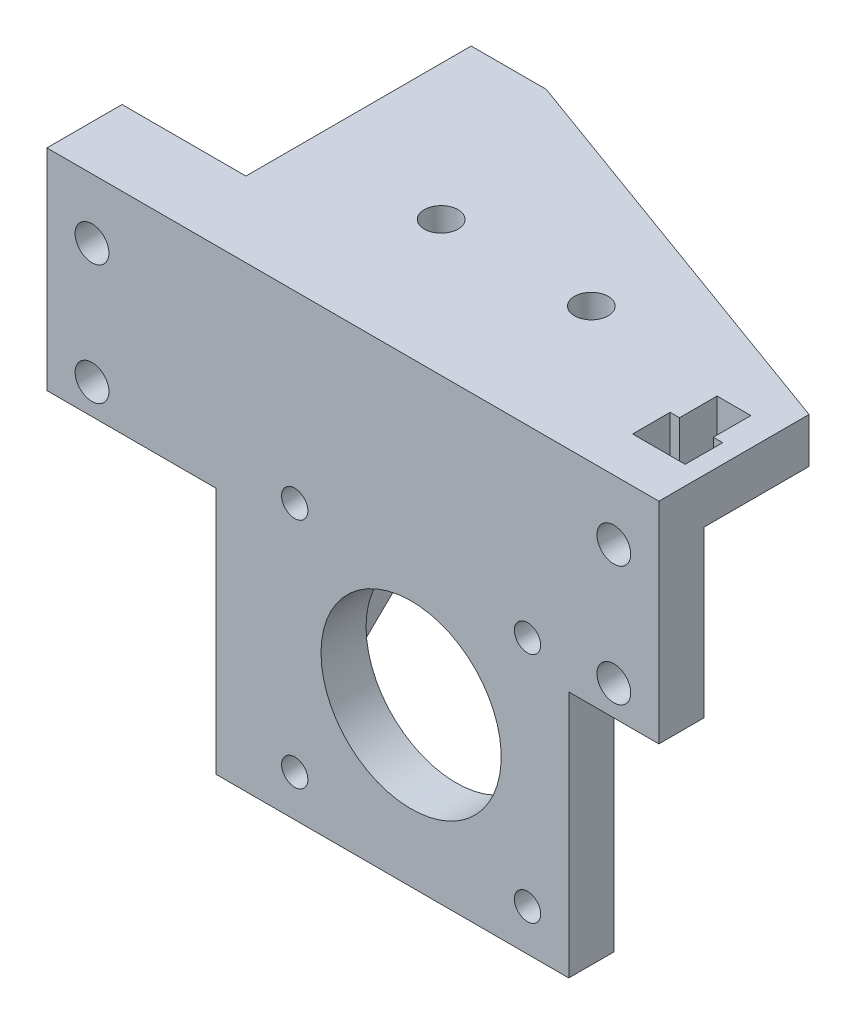
ISO-10303-21;
HEADER;
FILE_DESCRIPTION(('STEP AP214'),'2;1');
FILE_NAME('part.step','',(''),(''),'','','');
FILE_SCHEMA(('AUTOMOTIVE_DESIGN { 1 0 10303 214 1 1 1 1 }'));
ENDSEC;
DATA;
#1=APPLICATION_CONTEXT('core data for automotive mechanical design processes');
#2=APPLICATION_PROTOCOL_DEFINITION('international standard','automotive_design',2000,#1);
#3=PRODUCT_CONTEXT('',#1,'mechanical');
#4=PRODUCT('Part','Part','',(#3));
#5=PRODUCT_RELATED_PRODUCT_CATEGORY('part','',(#4));
#6=PRODUCT_DEFINITION_FORMATION('','',#4);
#7=PRODUCT_DEFINITION_CONTEXT('part definition',#1,'design');
#8=PRODUCT_DEFINITION('design','',#6,#7);
#9=PRODUCT_DEFINITION_SHAPE('','',#8);
#10=(LENGTH_UNIT() NAMED_UNIT(*) SI_UNIT(.MILLI.,.METRE.));
#11=(NAMED_UNIT(*) PLANE_ANGLE_UNIT() SI_UNIT($,.RADIAN.));
#12=(NAMED_UNIT(*) SI_UNIT($,.STERADIAN.) SOLID_ANGLE_UNIT());
#13=UNCERTAINTY_MEASURE_WITH_UNIT(LENGTH_MEASURE(1.E-05),#10,'distance_accuracy_value','');
#14=(GEOMETRIC_REPRESENTATION_CONTEXT(3) GLOBAL_UNCERTAINTY_ASSIGNED_CONTEXT((#13)) GLOBAL_UNIT_ASSIGNED_CONTEXT((#10,
#11,#12)) REPRESENTATION_CONTEXT('',''));
#15=CARTESIAN_POINT('',(0.,0.,0.));
#16=DIRECTION('',(0.,0.,1.));
#17=DIRECTION('',(1.,0.,0.));
#18=AXIS2_PLACEMENT_3D('',#15,#16,#17);
#19=CARTESIAN_POINT('',(10.,28.,-30.));
#20=DIRECTION('',(-1.,0.,0.));
#21=DIRECTION('',(0.,0.,1.));
#22=AXIS2_PLACEMENT_3D('',#19,#20,#21);
#23=PLANE('',#22);
#24=CARTESIAN_POINT('',(10.,17.5,-24.));
#25=DIRECTION('',(1.,0.,0.));
#26=DIRECTION('',(0.,0.,-1.));
#27=AXIS2_PLACEMENT_3D('',#24,#25,#26);
#28=CIRCLE('',#27,2.25);
#29=CARTESIAN_POINT('',(10.,17.5,-26.25));
#30=VERTEX_POINT('',#29);
#31=EDGE_CURVE('E541',#30,#30,#28,.T.);
#32=ORIENTED_EDGE('',*,*,#31,.F.);
#33=EDGE_LOOP('',(#32));
#34=FACE_BOUND('',#33,.T.);
#35=DIRECTION('',(0.,0.,1.));
#36=VECTOR('',#35,1.);
#37=CARTESIAN_POINT('',(10.,22.,-30.));
#38=LINE('',#37,#36);
#39=CARTESIAN_POINT('',(10.,22.,-30.));
#40=VERTEX_POINT('',#39);
#41=CARTESIAN_POINT('',(10.,22.,3.99999999999999));
#42=VERTEX_POINT('',#41);
#43=EDGE_CURVE('E372',#40,#42,#38,.T.);
#44=ORIENTED_EDGE('',*,*,#43,.T.);
#45=DIRECTION('',(0.,1.,0.));
#46=VECTOR('',#45,1.);
#47=CARTESIAN_POINT('',(10.,-33.,3.99999999999999));
#48=LINE('',#47,#46);
#49=CARTESIAN_POINT('',(10.,-33.,3.99999999999999));
#50=VERTEX_POINT('',#49);
#51=EDGE_CURVE('E41',#50,#42,#48,.T.);
#52=ORIENTED_EDGE('',*,*,#51,.F.);
#53=DIRECTION('',(0.,-0.69647537716866,0.717580691628316));
#54=VECTOR('',#53,1.);
#55=CARTESIAN_POINT('',(10.,0.,-30.));
#56=LINE('',#55,#54);
#57=CARTESIAN_POINT('',(10.,0.,-30.));
#58=VERTEX_POINT('',#57);
#59=EDGE_CURVE('E312',#58,#50,#56,.T.);
#60=ORIENTED_EDGE('',*,*,#59,.F.);
#61=DIRECTION('',(0.,-1.,0.));
#62=VECTOR('',#61,1.);
#63=CARTESIAN_POINT('',(10.,28.,-30.));
#64=LINE('',#63,#62);
#65=EDGE_CURVE('E227',#40,#58,#64,.T.);
#66=ORIENTED_EDGE('',*,*,#65,.F.);
#67=EDGE_LOOP('',(#44,#52,#60,#66));
#68=FACE_BOUND('',#67,.T.);
#69=ADVANCED_FACE('F32',(#34,#68),#23,.F.);
#70=CARTESIAN_POINT('',(10.,-33.,3.99999999999999));
#71=DIRECTION('',(0.,0.,-1.));
#72=DIRECTION('',(-1.,0.,0.));
#73=AXIS2_PLACEMENT_3D('',#70,#71,#72);
#74=PLANE('',#73);
#75=CARTESIAN_POINT('',(59.,20.,4.));
#76=DIRECTION('',(0.,0.,-1.));
#77=DIRECTION('',(-1.,0.,0.));
#78=AXIS2_PLACEMENT_3D('',#75,#76,#77);
#79=CIRCLE('',#78,2.25);
#80=CARTESIAN_POINT('',(56.75,20.,4.));
#81=VERTEX_POINT('',#80);
#82=EDGE_CURVE('E382',#81,#81,#79,.T.);
#83=ORIENTED_EDGE('',*,*,#82,.F.);
#84=EDGE_LOOP('',(#83));
#85=FACE_BOUND('',#84,.T.);
#86=CARTESIAN_POINT('',(32.,-12.,3.99999999999999));
#87=DIRECTION('',(0.,0.,-1.));
#88=DIRECTION('',(-1.,0.,0.));
#89=AXIS2_PLACEMENT_3D('',#86,#87,#88);
#90=CIRCLE('',#89,12.);
#91=CARTESIAN_POINT('',(20.,-12.,3.99999999999999));
#92=VERTEX_POINT('',#91);
#93=EDGE_CURVE('E276',#92,#92,#90,.T.);
#94=ORIENTED_EDGE('',*,*,#93,.F.);
#95=EDGE_LOOP('',(#94));
#96=FACE_BOUND('',#95,.T.);
#97=CARTESIAN_POINT('',(16.5,3.5,3.99999999999999));
#98=DIRECTION('',(0.,0.,-1.));
#99=DIRECTION('',(-1.,0.,0.));
#100=AXIS2_PLACEMENT_3D('',#97,#98,#99);
#101=CIRCLE('',#100,1.75);
#102=CARTESIAN_POINT('',(14.75,3.5,3.99999999999999));
#103=VERTEX_POINT('',#102);
#104=EDGE_CURVE('E270',#103,#103,#101,.T.);
#105=ORIENTED_EDGE('',*,*,#104,.F.);
#106=EDGE_LOOP('',(#105));
#107=FACE_BOUND('',#106,.T.);
#108=CARTESIAN_POINT('',(16.5,-27.5,3.99999999999999));
#109=DIRECTION('',(0.,0.,-1.));
#110=DIRECTION('',(-1.,0.,0.));
#111=AXIS2_PLACEMENT_3D('',#108,#109,#110);
#112=CIRCLE('',#111,1.75);
#113=CARTESIAN_POINT('',(14.75,-27.5,3.99999999999999));
#114=VERTEX_POINT('',#113);
#115=EDGE_CURVE('E264',#114,#114,#112,.T.);
#116=ORIENTED_EDGE('',*,*,#115,.F.);
#117=EDGE_LOOP('',(#116));
#118=FACE_BOUND('',#117,.T.);
#119=CARTESIAN_POINT('',(47.5,-27.5,3.99999999999999));
#120=DIRECTION('',(0.,0.,-1.));
#121=DIRECTION('',(-1.,0.,0.));
#122=AXIS2_PLACEMENT_3D('',#119,#120,#121);
#123=CIRCLE('',#122,1.75);
#124=CARTESIAN_POINT('',(45.75,-27.5,3.99999999999999));
#125=VERTEX_POINT('',#124);
#126=EDGE_CURVE('E258',#125,#125,#123,.T.);
#127=ORIENTED_EDGE('',*,*,#126,.F.);
#128=EDGE_LOOP('',(#127));
#129=FACE_BOUND('',#128,.T.);
#130=CARTESIAN_POINT('',(47.5,3.49999999999999,3.99999999999999));
#131=DIRECTION('',(0.,0.,-1.));
#132=DIRECTION('',(-1.,0.,0.));
#133=AXIS2_PLACEMENT_3D('',#130,#131,#132);
#134=CIRCLE('',#133,1.75);
#135=CARTESIAN_POINT('',(45.75,3.49999999999999,3.99999999999999));
#136=VERTEX_POINT('',#135);
#137=EDGE_CURVE('E252',#136,#136,#134,.T.);
#138=ORIENTED_EDGE('',*,*,#137,.F.);
#139=EDGE_LOOP('',(#138));
#140=FACE_BOUND('',#139,.T.);
#141=CARTESIAN_POINT('',(59.,4.,4.));
#142=DIRECTION('',(0.,0.,-1.));
#143=DIRECTION('',(-1.,0.,0.));
#144=AXIS2_PLACEMENT_3D('',#141,#142,#143);
#145=CIRCLE('',#144,2.24999999999999);
#146=CARTESIAN_POINT('',(56.75,4.,4.));
#147=VERTEX_POINT('',#146);
#148=EDGE_CURVE('E385',#147,#147,#145,.T.);
#149=ORIENTED_EDGE('',*,*,#148,.F.);
#150=EDGE_LOOP('',(#149));
#151=FACE_BOUND('',#150,.T.);
#152=ORIENTED_EDGE('',*,*,#51,.T.);
#153=DIRECTION('',(1.,0.,0.));
#154=VECTOR('',#153,1.);
#155=CARTESIAN_POINT('',(10.,22.,3.99999999999999));
#156=LINE('',#155,#154);
#157=CARTESIAN_POINT('',(55.5,22.,3.99999999999999));
#158=VERTEX_POINT('',#157);
#159=EDGE_CURVE('E376',#42,#158,#156,.T.);
#160=ORIENTED_EDGE('',*,*,#159,.T.);
#161=DIRECTION('',(0.,-1.,0.));
#162=VECTOR('',#161,1.);
#163=CARTESIAN_POINT('',(55.5,28.00005,3.99999999999999));
#164=LINE('',#163,#162);
#165=CARTESIAN_POINT('',(55.5,28.,3.99999999999999));
#166=VERTEX_POINT('',#165);
#167=EDGE_CURVE('E332',#166,#158,#164,.T.);
#168=ORIENTED_EDGE('',*,*,#167,.F.);
#169=DIRECTION('',(-1.,0.,0.));
#170=VECTOR('',#169,1.);
#171=CARTESIAN_POINT('',(0.,28.,3.99999999999999));
#172=LINE('',#171,#170);
#173=CARTESIAN_POINT('',(62.5,28.,3.99999999999999));
#174=VERTEX_POINT('',#173);
#175=EDGE_CURVE('E366',#174,#166,#172,.T.);
#176=ORIENTED_EDGE('',*,*,#175,.F.);
#177=DIRECTION('',(0.,-1.,0.));
#178=VECTOR('',#177,1.);
#179=CARTESIAN_POINT('',(62.5,28.00005,3.99999999999999));
#180=LINE('',#179,#178);
#181=CARTESIAN_POINT('',(62.5,22.,3.99999999999999));
#182=VERTEX_POINT('',#181);
#183=EDGE_CURVE('E335',#174,#182,#180,.T.);
#184=ORIENTED_EDGE('',*,*,#183,.T.);
#185=CARTESIAN_POINT('',(65.,22.,3.99999999999999));
#186=VERTEX_POINT('',#185);
#187=EDGE_CURVE('E375',#182,#186,#156,.T.);
#188=ORIENTED_EDGE('',*,*,#187,.T.);
#189=DIRECTION('',(0.,1.,0.));
#190=VECTOR('',#189,1.);
#191=CARTESIAN_POINT('',(65.,28.,3.99999999999999));
#192=LINE('',#191,#190);
#193=CARTESIAN_POINT('',(65.,0.,3.99999999999999));
#194=VERTEX_POINT('',#193);
#195=EDGE_CURVE('E394',#194,#186,#192,.T.);
#196=ORIENTED_EDGE('',*,*,#195,.F.);
#197=DIRECTION('',(-1.,0.,0.));
#198=VECTOR('',#197,1.);
#199=CARTESIAN_POINT('',(65.,0.,3.99999999999999));
#200=LINE('',#199,#198);
#201=CARTESIAN_POINT('',(53.,0.,3.99999999999999));
#202=VERTEX_POINT('',#201);
#203=EDGE_CURVE('E245',#194,#202,#200,.T.);
#204=ORIENTED_EDGE('',*,*,#203,.T.);
#205=DIRECTION('',(0.,1.,0.));
#206=VECTOR('',#205,1.);
#207=CARTESIAN_POINT('',(53.,-33.,3.99999999999999));
#208=LINE('',#207,#206);
#209=CARTESIAN_POINT('',(53.,-33.,3.99999999999999));
#210=VERTEX_POINT('',#209);
#211=EDGE_CURVE('E204',#210,#202,#208,.T.);
#212=ORIENTED_EDGE('',*,*,#211,.F.);
#213=DIRECTION('',(-1.,0.,0.));
#214=VECTOR('',#213,1.);
#215=CARTESIAN_POINT('',(10.,-33.,3.99999999999999));
#216=LINE('',#215,#214);
#217=EDGE_CURVE('E236',#210,#50,#216,.T.);
#218=ORIENTED_EDGE('',*,*,#217,.T.);
#219=EDGE_LOOP('',(#152,#160,#168,#176,#184,#188,#196,#204,#212,#218));
#220=FACE_BOUND('',#219,.T.);
#221=ADVANCED_FACE('F404',(#85,#96,#107,#118,#129,#140,#151,#220),#74,.T.);
#222=CARTESIAN_POINT('',(-16.5,28.,10.));
#223=DIRECTION('',(1.,0.,0.));
#224=DIRECTION('',(0.,0.,-1.));
#225=AXIS2_PLACEMENT_3D('',#222,#223,#224);
#226=PLANE('',#225);
#227=DIRECTION('',(0.,0.,1.));
#228=VECTOR('',#227,1.);
#229=CARTESIAN_POINT('',(-16.5,0.,10.));
#230=LINE('',#229,#228);
#231=CARTESIAN_POINT('',(-16.5,0.,0.));
#232=VERTEX_POINT('',#231);
#233=CARTESIAN_POINT('',(-16.5,0.,9.99999999999999));
#234=VERTEX_POINT('',#233);
#235=EDGE_CURVE('E183',#232,#234,#230,.T.);
#236=ORIENTED_EDGE('',*,*,#235,.T.);
#237=DIRECTION('',(0.,-1.,0.));
#238=VECTOR('',#237,1.);
#239=CARTESIAN_POINT('',(-16.5,0.,9.99999999999999));
#240=LINE('',#239,#238);
#241=CARTESIAN_POINT('',(-16.5,28.,9.99999999999999));
#242=VERTEX_POINT('',#241);
#243=EDGE_CURVE('E190',#242,#234,#240,.T.);
#244=ORIENTED_EDGE('',*,*,#243,.F.);
#245=DIRECTION('',(0.,0.,1.));
#246=VECTOR('',#245,1.);
#247=CARTESIAN_POINT('',(-16.5,28.,10.));
#248=LINE('',#247,#246);
#249=CARTESIAN_POINT('',(-16.5,28.,0.));
#250=VERTEX_POINT('',#249);
#251=EDGE_CURVE('E219',#250,#242,#248,.T.);
#252=ORIENTED_EDGE('',*,*,#251,.F.);
#253=DIRECTION('',(0.,-1.,0.));
#254=VECTOR('',#253,1.);
#255=CARTESIAN_POINT('',(-16.5,28.,0.));
#256=LINE('',#255,#254);
#257=EDGE_CURVE('E203',#250,#232,#256,.T.);
#258=ORIENTED_EDGE('',*,*,#257,.T.);
#259=EDGE_LOOP('',(#236,#244,#252,#258));
#260=FACE_BOUND('',#259,.T.);
#261=ADVANCED_FACE('F34',(#260),#226,.F.);
#262=CARTESIAN_POINT('',(10.,28.,9.99999999999999));
#263=DIRECTION('',(0.,0.,-1.));
#264=DIRECTION('',(-1.,0.,0.));
#265=AXIS2_PLACEMENT_3D('',#262,#263,#264);
#266=PLANE('',#265);
#267=CARTESIAN_POINT('',(32.,-12.,9.99999999999999));
#268=DIRECTION('',(0.,0.,-1.));
#269=DIRECTION('',(-1.,0.,0.));
#270=AXIS2_PLACEMENT_3D('',#267,#268,#269);
#271=CIRCLE('',#270,12.);
#272=CARTESIAN_POINT('',(20.,-12.,9.99999999999999));
#273=VERTEX_POINT('',#272);
#274=EDGE_CURVE('E279',#273,#273,#271,.T.);
#275=ORIENTED_EDGE('',*,*,#274,.T.);
#276=EDGE_LOOP('',(#275));
#277=FACE_BOUND('',#276,.T.);
#278=CARTESIAN_POINT('',(47.5,-27.5,9.99999999999999));
#279=DIRECTION('',(0.,0.,-1.));
#280=DIRECTION('',(-1.,0.,0.));
#281=AXIS2_PLACEMENT_3D('',#278,#279,#280);
#282=CIRCLE('',#281,1.75);
#283=CARTESIAN_POINT('',(45.75,-27.5,9.99999999999999));
#284=VERTEX_POINT('',#283);
#285=EDGE_CURVE('E261',#284,#284,#282,.T.);
#286=ORIENTED_EDGE('',*,*,#285,.T.);
#287=EDGE_LOOP('',(#286));
#288=FACE_BOUND('',#287,.T.);
#289=CARTESIAN_POINT('',(16.5,-27.5,9.99999999999999));
#290=DIRECTION('',(0.,0.,-1.));
#291=DIRECTION('',(-1.,0.,0.));
#292=AXIS2_PLACEMENT_3D('',#289,#290,#291);
#293=CIRCLE('',#292,1.75);
#294=CARTESIAN_POINT('',(14.75,-27.5,9.99999999999999));
#295=VERTEX_POINT('',#294);
#296=EDGE_CURVE('E267',#295,#295,#293,.T.);
#297=ORIENTED_EDGE('',*,*,#296,.T.);
#298=EDGE_LOOP('',(#297));
#299=FACE_BOUND('',#298,.T.);
#300=DIRECTION('',(0.,1.,0.));
#301=VECTOR('',#300,1.);
#302=CARTESIAN_POINT('',(53.,-33.,9.99999999999999));
#303=LINE('',#302,#301);
#304=CARTESIAN_POINT('',(53.,-33.,9.99999999999999));
#305=VERTEX_POINT('',#304);
#306=CARTESIAN_POINT('',(53.,0.,9.99999999999999));
#307=VERTEX_POINT('',#306);
#308=EDGE_CURVE('E206',#305,#307,#303,.T.);
#309=ORIENTED_EDGE('',*,*,#308,.T.);
#310=DIRECTION('',(-1.,0.,0.));
#311=VECTOR('',#310,1.);
#312=CARTESIAN_POINT('',(65.000025,0.,9.99999999999999));
#313=LINE('',#312,#311);
#314=CARTESIAN_POINT('',(65.,0.,9.99999999999999));
#315=VERTEX_POINT('',#314);
#316=EDGE_CURVE('E199',#315,#307,#313,.T.);
#317=ORIENTED_EDGE('',*,*,#316,.F.);
#318=DIRECTION('',(0.,1.,0.));
#319=VECTOR('',#318,1.);
#320=CARTESIAN_POINT('',(65.,12.,9.99999999999999));
#321=LINE('',#320,#319);
#322=CARTESIAN_POINT('',(65.,28.,9.99999999999999));
#323=VERTEX_POINT('',#322);
#324=EDGE_CURVE('E419',#315,#323,#321,.T.);
#325=ORIENTED_EDGE('',*,*,#324,.T.);
#326=DIRECTION('',(1.,0.,0.));
#327=VECTOR('',#326,1.);
#328=CARTESIAN_POINT('',(10.,28.,9.99999999999999));
#329=LINE('',#328,#327);
#330=EDGE_CURVE('E195',#242,#323,#329,.T.);
#331=ORIENTED_EDGE('',*,*,#330,.F.);
#332=ORIENTED_EDGE('',*,*,#243,.T.);
#333=DIRECTION('',(1.,0.,0.));
#334=VECTOR('',#333,1.);
#335=CARTESIAN_POINT('',(10.,0.,9.99999999999999));
#336=LINE('',#335,#334);
#337=CARTESIAN_POINT('',(6.00000000000001,0.,9.99999999999999));
#338=VERTEX_POINT('',#337);
#339=EDGE_CURVE('E178',#234,#338,#336,.T.);
#340=ORIENTED_EDGE('',*,*,#339,.T.);
#341=DIRECTION('',(0.,1.,0.));
#342=VECTOR('',#341,1.);
#343=CARTESIAN_POINT('',(6.00000000000001,-24.2647058823529,9.99999999999999));
#344=LINE('',#343,#342);
#345=CARTESIAN_POINT('',(6.00000000000001,-33.,9.99999999999999));
#346=VERTEX_POINT('',#345);
#347=EDGE_CURVE('E306',#346,#338,#344,.T.);
#348=ORIENTED_EDGE('',*,*,#347,.F.);
#349=DIRECTION('',(1.,0.,0.));
#350=VECTOR('',#349,1.);
#351=CARTESIAN_POINT('',(10.,-33.,9.99999999999999));
#352=LINE('',#351,#350);
#353=EDGE_CURVE('E282',#346,#305,#352,.T.);
#354=ORIENTED_EDGE('',*,*,#353,.T.);
#355=EDGE_LOOP('',(#309,#317,#325,#331,#332,#340,#348,#354));
#356=FACE_BOUND('',#355,.T.);
#357=CARTESIAN_POINT('',(16.5,3.5,9.99999999999999));
#358=DIRECTION('',(0.,0.,-1.));
#359=DIRECTION('',(-1.,0.,0.));
#360=AXIS2_PLACEMENT_3D('',#357,#358,#359);
#361=CIRCLE('',#360,1.75);
#362=CARTESIAN_POINT('',(14.75,3.5,9.99999999999999));
#363=VERTEX_POINT('',#362);
#364=EDGE_CURVE('E273',#363,#363,#361,.T.);
#365=ORIENTED_EDGE('',*,*,#364,.T.);
#366=EDGE_LOOP('',(#365));
#367=FACE_BOUND('',#366,.T.);
#368=CARTESIAN_POINT('',(47.5,3.49999999999999,9.99999999999999));
#369=DIRECTION('',(0.,0.,-1.));
#370=DIRECTION('',(-1.,0.,0.));
#371=AXIS2_PLACEMENT_3D('',#368,#369,#370);
#372=CIRCLE('',#371,1.75);
#373=CARTESIAN_POINT('',(45.75,3.49999999999999,9.99999999999999));
#374=VERTEX_POINT('',#373);
#375=EDGE_CURVE('E255',#374,#374,#372,.T.);
#376=ORIENTED_EDGE('',*,*,#375,.T.);
#377=EDGE_LOOP('',(#376));
#378=FACE_BOUND('',#377,.T.);
#379=CARTESIAN_POINT('',(59.,4.,9.99999999999999));
#380=DIRECTION('',(0.,0.,-1.));
#381=DIRECTION('',(-1.,0.,0.));
#382=AXIS2_PLACEMENT_3D('',#379,#380,#381);
#383=CIRCLE('',#382,2.24999999999999);
#384=CARTESIAN_POINT('',(56.75,4.,9.99999999999999));
#385=VERTEX_POINT('',#384);
#386=EDGE_CURVE('E409',#385,#385,#383,.F.);
#387=ORIENTED_EDGE('',*,*,#386,.F.);
#388=EDGE_LOOP('',(#387));
#389=FACE_BOUND('',#388,.T.);
#390=CARTESIAN_POINT('',(59.,20.,9.99999999999999));
#391=DIRECTION('',(0.,0.,-1.));
#392=DIRECTION('',(-1.,0.,0.));
#393=AXIS2_PLACEMENT_3D('',#390,#391,#392);
#394=CIRCLE('',#393,2.25);
#395=CARTESIAN_POINT('',(56.75,20.,9.99999999999999));
#396=VERTEX_POINT('',#395);
#397=EDGE_CURVE('E36',#396,#396,#394,.F.);
#398=ORIENTED_EDGE('',*,*,#397,.F.);
#399=EDGE_LOOP('',(#398));
#400=FACE_BOUND('',#399,.T.);
#401=CARTESIAN_POINT('',(-10.5,4.,9.99999999999999));
#402=DIRECTION('',(0.,0.,-1.));
#403=DIRECTION('',(-1.,0.,0.));
#404=AXIS2_PLACEMENT_3D('',#401,#402,#403);
#405=CIRCLE('',#404,2.25);
#406=CARTESIAN_POINT('',(-12.75,4.,9.99999999999999));
#407=VERTEX_POINT('',#406);
#408=EDGE_CURVE('E413',#407,#407,#405,.F.);
#409=ORIENTED_EDGE('',*,*,#408,.F.);
#410=EDGE_LOOP('',(#409));
#411=FACE_BOUND('',#410,.T.);
#412=CARTESIAN_POINT('',(-10.5,20.,9.99999999999999));
#413=DIRECTION('',(0.,0.,-1.));
#414=DIRECTION('',(-1.,0.,0.));
#415=AXIS2_PLACEMENT_3D('',#412,#413,#414);
#416=CIRCLE('',#415,2.25);
#417=CARTESIAN_POINT('',(-12.75,20.,9.99999999999999));
#418=VERTEX_POINT('',#417);
#419=EDGE_CURVE('E416',#418,#418,#416,.F.);
#420=ORIENTED_EDGE('',*,*,#419,.F.);
#421=EDGE_LOOP('',(#420));
#422=FACE_BOUND('',#421,.T.);
#423=ADVANCED_FACE('F192',(#277,#288,#299,#356,#367,#378,#389,#400,#411,#422),#266,.F.);
#424=CARTESIAN_POINT('',(0.,28.,-30.));
#425=DIRECTION('',(0.,0.,1.));
#426=DIRECTION('',(1.,0.,0.));
#427=AXIS2_PLACEMENT_3D('',#424,#425,#426);
#428=PLANE('',#427);
#429=DIRECTION('',(-1.,0.,0.));
#430=VECTOR('',#429,1.);
#431=CARTESIAN_POINT('',(0.,28.,-30.));
#432=LINE('',#431,#430);
#433=CARTESIAN_POINT('',(9.99999999999997,28.0000025,-30.));
#434=VERTEX_POINT('',#433);
#435=CARTESIAN_POINT('',(0.,28.,-30.));
#436=VERTEX_POINT('',#435);
#437=EDGE_CURVE('E438',#434,#436,#432,.T.);
#438=ORIENTED_EDGE('',*,*,#437,.F.);
#439=DIRECTION('',(0.,-1.,0.));
#440=VECTOR('',#439,1.);
#441=CARTESIAN_POINT('',(10.,28.00005,-30.));
#442=LINE('',#441,#440);
#443=EDGE_CURVE('E424',#434,#40,#442,.T.);
#444=ORIENTED_EDGE('',*,*,#443,.T.);
#445=ORIENTED_EDGE('',*,*,#65,.T.);
#446=DIRECTION('',(-1.,0.,0.));
#447=VECTOR('',#446,1.);
#448=CARTESIAN_POINT('',(0.,0.,-30.));
#449=LINE('',#448,#447);
#450=CARTESIAN_POINT('',(6.00000000000001,0.,-30.));
#451=VERTEX_POINT('',#450);
#452=EDGE_CURVE('E212',#58,#451,#449,.T.);
#453=ORIENTED_EDGE('',*,*,#452,.T.);
#454=CARTESIAN_POINT('',(0.,0.,-30.));
#455=VERTEX_POINT('',#454);
#456=EDGE_CURVE('E187',#451,#455,#449,.T.);
#457=ORIENTED_EDGE('',*,*,#456,.T.);
#458=DIRECTION('',(0.,-1.,0.));
#459=VECTOR('',#458,1.);
#460=CARTESIAN_POINT('',(0.,28.,-30.));
#461=LINE('',#460,#459);
#462=EDGE_CURVE('E224',#436,#455,#461,.T.);
#463=ORIENTED_EDGE('',*,*,#462,.F.);
#464=EDGE_LOOP('',(#438,#444,#445,#453,#457,#463));
#465=FACE_BOUND('',#464,.T.);
#466=ADVANCED_FACE('F474',(#465),#428,.F.);
#467=CARTESIAN_POINT('',(0.,28.,0.));
#468=DIRECTION('',(1.,0.,0.));
#469=DIRECTION('',(0.,0.,-1.));
#470=AXIS2_PLACEMENT_3D('',#467,#468,#469);
#471=PLANE('',#470);
#472=CARTESIAN_POINT('',(0.,17.5,-24.));
#473=DIRECTION('',(1.,0.,0.));
#474=DIRECTION('',(0.,0.,-1.));
#475=AXIS2_PLACEMENT_3D('',#472,#473,#474);
#476=CIRCLE('',#475,2.25);
#477=CARTESIAN_POINT('',(0.,17.5,-26.25));
#478=VERTEX_POINT('',#477);
#479=EDGE_CURVE('E437',#478,#478,#476,.T.);
#480=ORIENTED_EDGE('',*,*,#479,.T.);
#481=EDGE_LOOP('',(#480));
#482=FACE_BOUND('',#481,.T.);
#483=DIRECTION('',(0.,0.,1.));
#484=VECTOR('',#483,1.);
#485=CARTESIAN_POINT('',(0.,0.,0.));
#486=LINE('',#485,#484);
#487=CARTESIAN_POINT('',(0.,0.,0.));
#488=VERTEX_POINT('',#487);
#489=EDGE_CURVE('E215',#455,#488,#486,.T.);
#490=ORIENTED_EDGE('',*,*,#489,.T.);
#491=DIRECTION('',(0.,-1.,0.));
#492=VECTOR('',#491,1.);
#493=CARTESIAN_POINT('',(0.,28.,0.));
#494=LINE('',#493,#492);
#495=CARTESIAN_POINT('',(0.,28.,0.));
#496=VERTEX_POINT('',#495);
#497=EDGE_CURVE('E221',#496,#488,#494,.T.);
#498=ORIENTED_EDGE('',*,*,#497,.F.);
#499=DIRECTION('',(0.,0.,1.));
#500=VECTOR('',#499,1.);
#501=CARTESIAN_POINT('',(0.,28.,0.));
#502=LINE('',#501,#500);
#503=EDGE_CURVE('E440',#436,#496,#502,.T.);
#504=ORIENTED_EDGE('',*,*,#503,.F.);
#505=ORIENTED_EDGE('',*,*,#462,.T.);
#506=EDGE_LOOP('',(#490,#498,#504,#505));
#507=FACE_BOUND('',#506,.T.);
#508=ADVANCED_FACE('F482',(#482,#507),#471,.F.);
#509=CARTESIAN_POINT('',(-16.5,28.,0.));
#510=DIRECTION('',(0.,0.,1.));
#511=DIRECTION('',(1.,0.,0.));
#512=AXIS2_PLACEMENT_3D('',#509,#510,#511);
#513=PLANE('',#512);
#514=CARTESIAN_POINT('',(-10.5,4.,0.));
#515=DIRECTION('',(0.,0.,1.));
#516=DIRECTION('',(1.,0.,0.));
#517=AXIS2_PLACEMENT_3D('',#514,#515,#516);
#518=CIRCLE('',#517,2.25);
#519=CARTESIAN_POINT('',(-8.25,4.,0.));
#520=VERTEX_POINT('',#519);
#521=EDGE_CURVE('E388',#520,#520,#518,.T.);
#522=ORIENTED_EDGE('',*,*,#521,.T.);
#523=EDGE_LOOP('',(#522));
#524=FACE_BOUND('',#523,.T.);
#525=CARTESIAN_POINT('',(-10.5,20.,0.));
#526=DIRECTION('',(0.,0.,1.));
#527=DIRECTION('',(1.,0.,0.));
#528=AXIS2_PLACEMENT_3D('',#525,#526,#527);
#529=CIRCLE('',#528,2.25);
#530=CARTESIAN_POINT('',(-8.25,20.,0.));
#531=VERTEX_POINT('',#530);
#532=EDGE_CURVE('E391',#531,#531,#529,.T.);
#533=ORIENTED_EDGE('',*,*,#532,.T.);
#534=EDGE_LOOP('',(#533));
#535=FACE_BOUND('',#534,.T.);
#536=DIRECTION('',(-1.,0.,0.));
#537=VECTOR('',#536,1.);
#538=CARTESIAN_POINT('',(-16.5,0.,0.));
#539=LINE('',#538,#537);
#540=EDGE_CURVE('E217',#488,#232,#539,.T.);
#541=ORIENTED_EDGE('',*,*,#540,.T.);
#542=ORIENTED_EDGE('',*,*,#257,.F.);
#543=DIRECTION('',(-1.,0.,0.));
#544=VECTOR('',#543,1.);
#545=CARTESIAN_POINT('',(-16.5,28.,0.));
#546=LINE('',#545,#544);
#547=EDGE_CURVE('E210',#496,#250,#546,.T.);
#548=ORIENTED_EDGE('',*,*,#547,.F.);
#549=ORIENTED_EDGE('',*,*,#497,.T.);
#550=EDGE_LOOP('',(#541,#542,#548,#549));
#551=FACE_BOUND('',#550,.T.);
#552=ADVANCED_FACE('F449',(#524,#535,#551),#513,.F.);
#553=CARTESIAN_POINT('',(0.,28.,0.));
#554=DIRECTION('',(0.,-1.,0.));
#555=DIRECTION('',(0.,0.,-1.));
#556=AXIS2_PLACEMENT_3D('',#553,#554,#555);
#557=PLANE('',#556);
#558=CARTESIAN_POINT('',(38.,28.,-8.00000000000001));
#559=DIRECTION('',(0.,-1.,0.));
#560=DIRECTION('',(0.,0.,-1.));
#561=AXIS2_PLACEMENT_3D('',#558,#559,#560);
#562=CIRCLE('',#561,2.25);
#563=CARTESIAN_POINT('',(38.,28.,-10.25));
#564=VERTEX_POINT('',#563);
#565=EDGE_CURVE('E550',#564,#564,#562,.F.);
#566=ORIENTED_EDGE('',*,*,#565,.F.);
#567=EDGE_LOOP('',(#566));
#568=FACE_BOUND('',#567,.T.);
#569=CARTESIAN_POINT('',(18.,28.,-8.00000000000001));
#570=DIRECTION('',(0.,-1.,0.));
#571=DIRECTION('',(0.,0.,-1.));
#572=AXIS2_PLACEMENT_3D('',#569,#570,#571);
#573=CIRCLE('',#572,2.25);
#574=CARTESIAN_POINT('',(18.,28.,-10.25));
#575=VERTEX_POINT('',#574);
#576=EDGE_CURVE('E545',#575,#575,#573,.F.);
#577=ORIENTED_EDGE('',*,*,#576,.F.);
#578=EDGE_LOOP('',(#577));
#579=FACE_BOUND('',#578,.T.);
#580=ORIENTED_EDGE('',*,*,#175,.T.);
#581=DIRECTION('',(0.,0.,-1.));
#582=VECTOR('',#581,1.);
#583=CARTESIAN_POINT('',(55.5,28.,0.));
#584=LINE('',#583,#582);
#585=CARTESIAN_POINT('',(55.5,28.,-1.00000000000001));
#586=VERTEX_POINT('',#585);
#587=EDGE_CURVE('E369',#166,#586,#584,.T.);
#588=ORIENTED_EDGE('',*,*,#587,.T.);
#589=DIRECTION('',(1.,0.,0.));
#590=VECTOR('',#589,1.);
#591=CARTESIAN_POINT('',(0.,28.,-1.00000000000001));
#592=LINE('',#591,#590);
#593=CARTESIAN_POINT('',(56.75,28.,-1.00000000000001));
#594=VERTEX_POINT('',#593);
#595=EDGE_CURVE('E334',#586,#594,#592,.T.);
#596=ORIENTED_EDGE('',*,*,#595,.T.);
#597=DIRECTION('',(0.,0.,-1.));
#598=VECTOR('',#597,1.);
#599=CARTESIAN_POINT('',(56.75,28.,0.));
#600=LINE('',#599,#598);
#601=CARTESIAN_POINT('',(56.75,28.,-6.00000000000001));
#602=VERTEX_POINT('',#601);
#603=EDGE_CURVE('E351',#594,#602,#600,.T.);
#604=ORIENTED_EDGE('',*,*,#603,.T.);
#605=DIRECTION('',(1.,0.,0.));
#606=VECTOR('',#605,1.);
#607=CARTESIAN_POINT('',(0.,28.,-6.00000000000001));
#608=LINE('',#607,#606);
#609=CARTESIAN_POINT('',(61.25,28.,-6.00000000000001));
#610=VERTEX_POINT('',#609);
#611=EDGE_CURVE('E354',#602,#610,#608,.T.);
#612=ORIENTED_EDGE('',*,*,#611,.T.);
#613=DIRECTION('',(0.,0.,1.));
#614=VECTOR('',#613,1.);
#615=CARTESIAN_POINT('',(61.25,28.,0.));
#616=LINE('',#615,#614);
#617=CARTESIAN_POINT('',(61.25,28.,-1.00000000000001));
#618=VERTEX_POINT('',#617);
#619=EDGE_CURVE('E357',#610,#618,#616,.T.);
#620=ORIENTED_EDGE('',*,*,#619,.T.);
#621=DIRECTION('',(1.,0.,0.));
#622=VECTOR('',#621,1.);
#623=CARTESIAN_POINT('',(0.,28.,-1.00000000000001));
#624=LINE('',#623,#622);
#625=CARTESIAN_POINT('',(62.5,28.,-1.00000000000001));
#626=VERTEX_POINT('',#625);
#627=EDGE_CURVE('E360',#618,#626,#624,.T.);
#628=ORIENTED_EDGE('',*,*,#627,.T.);
#629=DIRECTION('',(0.,0.,1.));
#630=VECTOR('',#629,1.);
#631=CARTESIAN_POINT('',(62.5,28.,0.));
#632=LINE('',#631,#630);
#633=EDGE_CURVE('E363',#626,#174,#632,.T.);
#634=ORIENTED_EDGE('',*,*,#633,.T.);
#635=EDGE_LOOP('',(#580,#588,#596,#604,#612,#620,#628,#634));
#636=FACE_BOUND('',#635,.T.);
#637=ORIENTED_EDGE('',*,*,#251,.T.);
#638=ORIENTED_EDGE('',*,*,#330,.T.);
#639=DIRECTION('',(0.,0.,1.));
#640=VECTOR('',#639,1.);
#641=CARTESIAN_POINT('',(65.,28.,3.99999999999999));
#642=LINE('',#641,#640);
#643=CARTESIAN_POINT('',(65.,28.,-10.));
#644=VERTEX_POINT('',#643);
#645=EDGE_CURVE('E396',#644,#323,#642,.T.);
#646=ORIENTED_EDGE('',*,*,#645,.F.);
#647=DIRECTION('',(-0.939793423488437,0.,-0.341743063086704));
#648=VECTOR('',#647,1.);
#649=CARTESIAN_POINT('',(10.8029197080292,28.,-29.7080291970803));
#650=LINE('',#649,#648);
#651=EDGE_CURVE('E427',#644,#434,#650,.T.);
#652=ORIENTED_EDGE('',*,*,#651,.T.);
#653=ORIENTED_EDGE('',*,*,#437,.T.);
#654=ORIENTED_EDGE('',*,*,#503,.T.);
#655=ORIENTED_EDGE('',*,*,#547,.T.);
#656=EDGE_LOOP('',(#637,#638,#646,#652,#653,#654,#655));
#657=FACE_BOUND('',#656,.T.);
#658=ADVANCED_FACE('F447',(#568,#579,#636,#657),#557,.F.);
#659=CARTESIAN_POINT('',(0.,0.,0.));
#660=DIRECTION('',(0.,-1.,0.));
#661=DIRECTION('',(0.,0.,-1.));
#662=AXIS2_PLACEMENT_3D('',#659,#660,#661);
#663=PLANE('',#662);
#664=ORIENTED_EDGE('',*,*,#339,.F.);
#665=ORIENTED_EDGE('',*,*,#235,.F.);
#666=ORIENTED_EDGE('',*,*,#540,.F.);
#667=ORIENTED_EDGE('',*,*,#489,.F.);
#668=ORIENTED_EDGE('',*,*,#456,.F.);
#669=DIRECTION('',(0.,0.,-1.));
#670=VECTOR('',#669,1.);
#671=CARTESIAN_POINT('',(6.00000000000001,0.,-15.));
#672=LINE('',#671,#670);
#673=EDGE_CURVE('E57',#338,#451,#672,.T.);
#674=ORIENTED_EDGE('',*,*,#673,.F.);
#675=EDGE_LOOP('',(#664,#665,#666,#667,#668,#674));
#676=FACE_BOUND('',#675,.T.);
#677=ADVANCED_FACE('F180',(#676),#663,.T.);
#678=CARTESIAN_POINT('',(53.,-33.,9.99999999999999));
#679=DIRECTION('',(1.,0.,0.));
#680=DIRECTION('',(0.,0.,-1.));
#681=AXIS2_PLACEMENT_3D('',#678,#679,#680);
#682=PLANE('',#681);
#683=DIRECTION('',(0.,0.,-1.));
#684=VECTOR('',#683,1.);
#685=CARTESIAN_POINT('',(53.,0.,3.99999999999999));
#686=LINE('',#685,#684);
#687=EDGE_CURVE('E11',#307,#202,#686,.T.);
#688=ORIENTED_EDGE('',*,*,#687,.F.);
#689=ORIENTED_EDGE('',*,*,#308,.F.);
#690=DIRECTION('',(0.,0.,-1.));
#691=VECTOR('',#690,1.);
#692=CARTESIAN_POINT('',(53.,-33.,9.99999999999999));
#693=LINE('',#692,#691);
#694=EDGE_CURVE('E284',#305,#210,#693,.T.);
#695=ORIENTED_EDGE('',*,*,#694,.T.);
#696=ORIENTED_EDGE('',*,*,#211,.T.);
#697=EDGE_LOOP('',(#688,#689,#695,#696));
#698=FACE_BOUND('',#697,.T.);
#699=ADVANCED_FACE('F294',(#698),#682,.T.);
#700=CARTESIAN_POINT('',(0.,-33.,0.));
#701=DIRECTION('',(0.,-1.,0.));
#702=DIRECTION('',(0.,0.,-1.));
#703=AXIS2_PLACEMENT_3D('',#700,#701,#702);
#704=PLANE('',#703);
#705=ORIENTED_EDGE('',*,*,#353,.F.);
#706=DIRECTION('',(0.,0.,1.));
#707=VECTOR('',#706,1.);
#708=CARTESIAN_POINT('',(6.00000000000001,-33.,3.99999999999999));
#709=LINE('',#708,#707);
#710=CARTESIAN_POINT('',(6.00000000000001,-33.,3.99999999999999));
#711=VERTEX_POINT('',#710);
#712=EDGE_CURVE('E302',#711,#346,#709,.T.);
#713=ORIENTED_EDGE('',*,*,#712,.F.);
#714=DIRECTION('',(1.,0.,0.));
#715=VECTOR('',#714,1.);
#716=CARTESIAN_POINT('',(6.00000000000001,-33.,3.99999999999999));
#717=LINE('',#716,#715);
#718=EDGE_CURVE('E301',#711,#50,#717,.T.);
#719=ORIENTED_EDGE('',*,*,#718,.T.);
#720=ORIENTED_EDGE('',*,*,#217,.F.);
#721=ORIENTED_EDGE('',*,*,#694,.F.);
#722=EDGE_LOOP('',(#705,#713,#719,#720,#721));
#723=FACE_BOUND('',#722,.T.);
#724=ADVANCED_FACE('F296',(#723),#704,.T.);
#725=CARTESIAN_POINT('',(32.,-12.,10.00005));
#726=DIRECTION('',(0.,0.,-1.));
#727=DIRECTION('',(-1.,0.,0.));
#728=AXIS2_PLACEMENT_3D('',#725,#726,#727);
#729=CYLINDRICAL_SURFACE('',#728,12.);
#730=ORIENTED_EDGE('',*,*,#93,.T.);
#731=EDGE_LOOP('',(#730));
#732=FACE_BOUND('',#731,.T.);
#733=ORIENTED_EDGE('',*,*,#274,.F.);
#734=EDGE_LOOP('',(#733));
#735=FACE_BOUND('',#734,.T.);
#736=ADVANCED_FACE('F502',(#732,#735),#729,.F.);
#737=CARTESIAN_POINT('',(16.5,3.5,10.00005));
#738=DIRECTION('',(0.,0.,-1.));
#739=DIRECTION('',(-1.,0.,0.));
#740=AXIS2_PLACEMENT_3D('',#737,#738,#739);
#741=CYLINDRICAL_SURFACE('',#740,1.75);
#742=ORIENTED_EDGE('',*,*,#104,.T.);
#743=EDGE_LOOP('',(#742));
#744=FACE_BOUND('',#743,.T.);
#745=ORIENTED_EDGE('',*,*,#364,.F.);
#746=EDGE_LOOP('',(#745));
#747=FACE_BOUND('',#746,.T.);
#748=ADVANCED_FACE('F493',(#744,#747),#741,.F.);
#749=CARTESIAN_POINT('',(16.5,-27.5,10.00005));
#750=DIRECTION('',(0.,0.,-1.));
#751=DIRECTION('',(-1.,0.,0.));
#752=AXIS2_PLACEMENT_3D('',#749,#750,#751);
#753=CYLINDRICAL_SURFACE('',#752,1.75);
#754=ORIENTED_EDGE('',*,*,#115,.T.);
#755=EDGE_LOOP('',(#754));
#756=FACE_BOUND('',#755,.T.);
#757=ORIENTED_EDGE('',*,*,#296,.F.);
#758=EDGE_LOOP('',(#757));
#759=FACE_BOUND('',#758,.T.);
#760=ADVANCED_FACE('F490',(#756,#759),#753,.F.);
#761=CARTESIAN_POINT('',(47.5,-27.5,10.00005));
#762=DIRECTION('',(0.,0.,-1.));
#763=DIRECTION('',(-1.,0.,0.));
#764=AXIS2_PLACEMENT_3D('',#761,#762,#763);
#765=CYLINDRICAL_SURFACE('',#764,1.75);
#766=ORIENTED_EDGE('',*,*,#126,.T.);
#767=EDGE_LOOP('',(#766));
#768=FACE_BOUND('',#767,.T.);
#769=ORIENTED_EDGE('',*,*,#285,.F.);
#770=EDGE_LOOP('',(#769));
#771=FACE_BOUND('',#770,.T.);
#772=ADVANCED_FACE('F492',(#768,#771),#765,.F.);
#773=CARTESIAN_POINT('',(47.5,3.49999999999999,10.00005));
#774=DIRECTION('',(0.,0.,-1.));
#775=DIRECTION('',(-1.,0.,0.));
#776=AXIS2_PLACEMENT_3D('',#773,#774,#775);
#777=CYLINDRICAL_SURFACE('',#776,1.75);
#778=ORIENTED_EDGE('',*,*,#137,.T.);
#779=EDGE_LOOP('',(#778));
#780=FACE_BOUND('',#779,.T.);
#781=ORIENTED_EDGE('',*,*,#375,.F.);
#782=EDGE_LOOP('',(#781));
#783=FACE_BOUND('',#782,.T.);
#784=ADVANCED_FACE('F461',(#780,#783),#777,.F.);
#785=CARTESIAN_POINT('',(65.,0.,3.99999999999999));
#786=DIRECTION('',(0.,1.,0.));
#787=DIRECTION('',(0.,0.,1.));
#788=AXIS2_PLACEMENT_3D('',#785,#786,#787);
#789=PLANE('',#788);
#790=DIRECTION('',(0.,0.,-1.));
#791=VECTOR('',#790,1.);
#792=CARTESIAN_POINT('',(65.,0.,3.99999999999999));
#793=LINE('',#792,#791);
#794=EDGE_CURVE('E250',#315,#194,#793,.T.);
#795=ORIENTED_EDGE('',*,*,#794,.F.);
#796=ORIENTED_EDGE('',*,*,#316,.T.);
#797=ORIENTED_EDGE('',*,*,#687,.T.);
#798=ORIENTED_EDGE('',*,*,#203,.F.);
#799=EDGE_LOOP('',(#795,#796,#797,#798));
#800=FACE_BOUND('',#799,.T.);
#801=ADVANCED_FACE('F406',(#800),#789,.F.);
#802=CARTESIAN_POINT('',(65.,12.,18.));
#803=DIRECTION('',(1.,0.,0.));
#804=DIRECTION('',(0.,0.,-1.));
#805=AXIS2_PLACEMENT_3D('',#802,#803,#804);
#806=PLANE('',#805);
#807=ORIENTED_EDGE('',*,*,#324,.F.);
#808=ORIENTED_EDGE('',*,*,#794,.T.);
#809=ORIENTED_EDGE('',*,*,#195,.T.);
#810=DIRECTION('',(0.,0.,-1.));
#811=VECTOR('',#810,1.);
#812=CARTESIAN_POINT('',(65.,22.,-30.));
#813=LINE('',#812,#811);
#814=CARTESIAN_POINT('',(65.,22.,-10.));
#815=VERTEX_POINT('',#814);
#816=EDGE_CURVE('E379',#186,#815,#813,.T.);
#817=ORIENTED_EDGE('',*,*,#816,.T.);
#818=DIRECTION('',(0.,-1.,0.));
#819=VECTOR('',#818,1.);
#820=CARTESIAN_POINT('',(65.,28.00005,-10.));
#821=LINE('',#820,#819);
#822=EDGE_CURVE('E49',#644,#815,#821,.T.);
#823=ORIENTED_EDGE('',*,*,#822,.F.);
#824=ORIENTED_EDGE('',*,*,#645,.T.);
#825=EDGE_LOOP('',(#807,#808,#809,#817,#823,#824));
#826=FACE_BOUND('',#825,.T.);
#827=ADVANCED_FACE('F450',(#826),#806,.T.);
#828=CARTESIAN_POINT('',(-10.5,20.,-30.000025));
#829=DIRECTION('',(0.,0.,1.));
#830=DIRECTION('',(1.,0.,0.));
#831=AXIS2_PLACEMENT_3D('',#828,#829,#830);
#832=CYLINDRICAL_SURFACE('',#831,2.25);
#833=ORIENTED_EDGE('',*,*,#419,.T.);
#834=EDGE_LOOP('',(#833));
#835=FACE_BOUND('',#834,.T.);
#836=ORIENTED_EDGE('',*,*,#532,.F.);
#837=EDGE_LOOP('',(#836));
#838=FACE_BOUND('',#837,.T.);
#839=ADVANCED_FACE('F452',(#835,#838),#832,.F.);
#840=CARTESIAN_POINT('',(-10.5,4.,-30.000025));
#841=DIRECTION('',(0.,0.,1.));
#842=DIRECTION('',(1.,0.,0.));
#843=AXIS2_PLACEMENT_3D('',#840,#841,#842);
#844=CYLINDRICAL_SURFACE('',#843,2.25);
#845=ORIENTED_EDGE('',*,*,#408,.T.);
#846=EDGE_LOOP('',(#845));
#847=FACE_BOUND('',#846,.T.);
#848=ORIENTED_EDGE('',*,*,#521,.F.);
#849=EDGE_LOOP('',(#848));
#850=FACE_BOUND('',#849,.T.);
#851=ADVANCED_FACE('F458',(#847,#850),#844,.F.);
#852=CARTESIAN_POINT('',(59.,4.,-30.000025));
#853=DIRECTION('',(0.,0.,1.));
#854=DIRECTION('',(1.,0.,0.));
#855=AXIS2_PLACEMENT_3D('',#852,#853,#854);
#856=CYLINDRICAL_SURFACE('',#855,2.24999999999999);
#857=ORIENTED_EDGE('',*,*,#386,.T.);
#858=EDGE_LOOP('',(#857));
#859=FACE_BOUND('',#858,.T.);
#860=ORIENTED_EDGE('',*,*,#148,.T.);
#861=EDGE_LOOP('',(#860));
#862=FACE_BOUND('',#861,.T.);
#863=ADVANCED_FACE('F610',(#859,#862),#856,.F.);
#864=CARTESIAN_POINT('',(59.,20.,-30.000025));
#865=DIRECTION('',(0.,0.,1.));
#866=DIRECTION('',(1.,0.,0.));
#867=AXIS2_PLACEMENT_3D('',#864,#865,#866);
#868=CYLINDRICAL_SURFACE('',#867,2.25);
#869=ORIENTED_EDGE('',*,*,#397,.T.);
#870=EDGE_LOOP('',(#869));
#871=FACE_BOUND('',#870,.T.);
#872=ORIENTED_EDGE('',*,*,#82,.T.);
#873=EDGE_LOOP('',(#872));
#874=FACE_BOUND('',#873,.T.);
#875=ADVANCED_FACE('F563',(#871,#874),#868,.F.);
#876=CARTESIAN_POINT('',(0.,22.,0.));
#877=DIRECTION('',(0.,1.,0.));
#878=DIRECTION('',(0.,0.,1.));
#879=AXIS2_PLACEMENT_3D('',#876,#877,#878);
#880=PLANE('',#879);
#881=CARTESIAN_POINT('',(38.,22.,-8.00000000000001));
#882=DIRECTION('',(0.,-1.,0.));
#883=DIRECTION('',(0.,0.,-1.));
#884=AXIS2_PLACEMENT_3D('',#881,#882,#883);
#885=CIRCLE('',#884,2.25);
#886=CARTESIAN_POINT('',(38.,22.,-10.25));
#887=VERTEX_POINT('',#886);
#888=EDGE_CURVE('E433',#887,#887,#885,.T.);
#889=ORIENTED_EDGE('',*,*,#888,.F.);
#890=EDGE_LOOP('',(#889));
#891=FACE_BOUND('',#890,.T.);
#892=CARTESIAN_POINT('',(18.,22.,-8.00000000000001));
#893=DIRECTION('',(0.,-1.,0.));
#894=DIRECTION('',(0.,0.,-1.));
#895=AXIS2_PLACEMENT_3D('',#892,#893,#894);
#896=CIRCLE('',#895,2.25);
#897=CARTESIAN_POINT('',(18.,22.,-10.25));
#898=VERTEX_POINT('',#897);
#899=EDGE_CURVE('E548',#898,#898,#896,.T.);
#900=ORIENTED_EDGE('',*,*,#899,.F.);
#901=EDGE_LOOP('',(#900));
#902=FACE_BOUND('',#901,.T.);
#903=ORIENTED_EDGE('',*,*,#43,.F.);
#904=DIRECTION('',(-0.939793423488437,0.,-0.341743063086704));
#905=VECTOR('',#904,1.);
#906=CARTESIAN_POINT('',(10.,22.,-30.));
#907=LINE('',#906,#905);
#908=EDGE_CURVE('E421',#815,#40,#907,.T.);
#909=ORIENTED_EDGE('',*,*,#908,.F.);
#910=ORIENTED_EDGE('',*,*,#816,.F.);
#911=ORIENTED_EDGE('',*,*,#187,.F.);
#912=DIRECTION('',(0.,0.,1.));
#913=VECTOR('',#912,1.);
#914=CARTESIAN_POINT('',(62.5,22.,3.99999999999999));
#915=LINE('',#914,#913);
#916=CARTESIAN_POINT('',(62.5,22.,-1.00000000000001));
#917=VERTEX_POINT('',#916);
#918=EDGE_CURVE('E328',#917,#182,#915,.T.);
#919=ORIENTED_EDGE('',*,*,#918,.F.);
#920=DIRECTION('',(1.,0.,0.));
#921=VECTOR('',#920,1.);
#922=CARTESIAN_POINT('',(61.25,22.,-1.00000000000001));
#923=LINE('',#922,#921);
#924=CARTESIAN_POINT('',(61.25,22.,-1.00000000000001));
#925=VERTEX_POINT('',#924);
#926=EDGE_CURVE('E325',#925,#917,#923,.T.);
#927=ORIENTED_EDGE('',*,*,#926,.F.);
#928=DIRECTION('',(0.,0.,1.));
#929=VECTOR('',#928,1.);
#930=CARTESIAN_POINT('',(61.25,22.,-1.00000000000001));
#931=LINE('',#930,#929);
#932=CARTESIAN_POINT('',(61.25,22.,-6.00000000000001));
#933=VERTEX_POINT('',#932);
#934=EDGE_CURVE('E322',#933,#925,#931,.T.);
#935=ORIENTED_EDGE('',*,*,#934,.F.);
#936=DIRECTION('',(1.,0.,0.));
#937=VECTOR('',#936,1.);
#938=CARTESIAN_POINT('',(56.75,22.,-6.00000000000001));
#939=LINE('',#938,#937);
#940=CARTESIAN_POINT('',(56.75,22.,-6.00000000000001));
#941=VERTEX_POINT('',#940);
#942=EDGE_CURVE('E319',#941,#933,#939,.T.);
#943=ORIENTED_EDGE('',*,*,#942,.F.);
#944=DIRECTION('',(0.,0.,-1.));
#945=VECTOR('',#944,1.);
#946=CARTESIAN_POINT('',(56.75,22.,-1.00000000000001));
#947=LINE('',#946,#945);
#948=CARTESIAN_POINT('',(56.75,22.,-1.00000000000001));
#949=VERTEX_POINT('',#948);
#950=EDGE_CURVE('E316',#949,#941,#947,.T.);
#951=ORIENTED_EDGE('',*,*,#950,.F.);
#952=DIRECTION('',(1.,0.,0.));
#953=VECTOR('',#952,1.);
#954=CARTESIAN_POINT('',(55.5,22.,-1.00000000000001));
#955=LINE('',#954,#953);
#956=CARTESIAN_POINT('',(55.5,22.,-1.00000000000001));
#957=VERTEX_POINT('',#956);
#958=EDGE_CURVE('E308',#957,#949,#955,.T.);
#959=ORIENTED_EDGE('',*,*,#958,.F.);
#960=DIRECTION('',(0.,0.,-1.));
#961=VECTOR('',#960,1.);
#962=CARTESIAN_POINT('',(55.5,22.,3.99999999999999));
#963=LINE('',#962,#961);
#964=EDGE_CURVE('E305',#158,#957,#963,.T.);
#965=ORIENTED_EDGE('',*,*,#964,.F.);
#966=ORIENTED_EDGE('',*,*,#159,.F.);
#967=EDGE_LOOP('',(#903,#909,#910,#911,#919,#927,#935,#943,#951,#959,#965,#966));
#968=FACE_BOUND('',#967,.T.);
#969=ADVANCED_FACE('F559',(#891,#902,#968),#880,.F.);
#970=CARTESIAN_POINT('',(55.5,28.00005,3.99999999999999));
#971=DIRECTION('',(-1.,0.,0.));
#972=DIRECTION('',(0.,0.,1.));
#973=AXIS2_PLACEMENT_3D('',#970,#971,#972);
#974=PLANE('',#973);
#975=ORIENTED_EDGE('',*,*,#167,.T.);
#976=ORIENTED_EDGE('',*,*,#964,.T.);
#977=DIRECTION('',(0.,-1.,0.));
#978=VECTOR('',#977,1.);
#979=CARTESIAN_POINT('',(55.5,28.00005,-1.00000000000001));
#980=LINE('',#979,#978);
#981=EDGE_CURVE('E331',#586,#957,#980,.T.);
#982=ORIENTED_EDGE('',*,*,#981,.F.);
#983=ORIENTED_EDGE('',*,*,#587,.F.);
#984=EDGE_LOOP('',(#975,#976,#982,#983));
#985=FACE_BOUND('',#984,.T.);
#986=ADVANCED_FACE('F562',(#985),#974,.F.);
#987=CARTESIAN_POINT('',(62.5,28.00005,3.99999999999999));
#988=DIRECTION('',(1.,0.,0.));
#989=DIRECTION('',(0.,0.,-1.));
#990=AXIS2_PLACEMENT_3D('',#987,#988,#989);
#991=PLANE('',#990);
#992=DIRECTION('',(0.,-1.,0.));
#993=VECTOR('',#992,1.);
#994=CARTESIAN_POINT('',(62.5,28.00005,-1.00000000000001));
#995=LINE('',#994,#993);
#996=EDGE_CURVE('E337',#626,#917,#995,.T.);
#997=ORIENTED_EDGE('',*,*,#996,.T.);
#998=ORIENTED_EDGE('',*,*,#918,.T.);
#999=ORIENTED_EDGE('',*,*,#183,.F.);
#1000=ORIENTED_EDGE('',*,*,#633,.F.);
#1001=EDGE_LOOP('',(#997,#998,#999,#1000));
#1002=FACE_BOUND('',#1001,.T.);
#1003=ADVANCED_FACE('F576',(#1002),#991,.F.);
#1004=CARTESIAN_POINT('',(61.25,28.00005,-1.00000000000001));
#1005=DIRECTION('',(0.,0.,-1.));
#1006=DIRECTION('',(-1.,0.,0.));
#1007=AXIS2_PLACEMENT_3D('',#1004,#1005,#1006);
#1008=PLANE('',#1007);
#1009=DIRECTION('',(0.,-1.,0.));
#1010=VECTOR('',#1009,1.);
#1011=CARTESIAN_POINT('',(61.25,28.00005,-1.00000000000001));
#1012=LINE('',#1011,#1010);
#1013=EDGE_CURVE('E339',#618,#925,#1012,.T.);
#1014=ORIENTED_EDGE('',*,*,#1013,.T.);
#1015=ORIENTED_EDGE('',*,*,#926,.T.);
#1016=ORIENTED_EDGE('',*,*,#996,.F.);
#1017=ORIENTED_EDGE('',*,*,#627,.F.);
#1018=EDGE_LOOP('',(#1014,#1015,#1016,#1017));
#1019=FACE_BOUND('',#1018,.T.);
#1020=ADVANCED_FACE('F578',(#1019),#1008,.F.);
#1021=CARTESIAN_POINT('',(61.25,28.00005,-1.00000000000001));
#1022=DIRECTION('',(1.,0.,0.));
#1023=DIRECTION('',(0.,0.,-1.));
#1024=AXIS2_PLACEMENT_3D('',#1021,#1022,#1023);
#1025=PLANE('',#1024);
#1026=DIRECTION('',(0.,-1.,0.));
#1027=VECTOR('',#1026,1.);
#1028=CARTESIAN_POINT('',(61.25,28.00005,-6.00000000000001));
#1029=LINE('',#1028,#1027);
#1030=EDGE_CURVE('E341',#610,#933,#1029,.T.);
#1031=ORIENTED_EDGE('',*,*,#1030,.T.);
#1032=ORIENTED_EDGE('',*,*,#934,.T.);
#1033=ORIENTED_EDGE('',*,*,#1013,.F.);
#1034=ORIENTED_EDGE('',*,*,#619,.F.);
#1035=EDGE_LOOP('',(#1031,#1032,#1033,#1034));
#1036=FACE_BOUND('',#1035,.T.);
#1037=ADVANCED_FACE('F587',(#1036),#1025,.F.);
#1038=CARTESIAN_POINT('',(56.75,28.00005,-6.00000000000001));
#1039=DIRECTION('',(0.,0.,-1.));
#1040=DIRECTION('',(-1.,0.,0.));
#1041=AXIS2_PLACEMENT_3D('',#1038,#1039,#1040);
#1042=PLANE('',#1041);
#1043=DIRECTION('',(0.,-1.,0.));
#1044=VECTOR('',#1043,1.);
#1045=CARTESIAN_POINT('',(56.75,28.00005,-6.00000000000001));
#1046=LINE('',#1045,#1044);
#1047=EDGE_CURVE('E343',#602,#941,#1046,.T.);
#1048=ORIENTED_EDGE('',*,*,#1047,.T.);
#1049=ORIENTED_EDGE('',*,*,#942,.T.);
#1050=ORIENTED_EDGE('',*,*,#1030,.F.);
#1051=ORIENTED_EDGE('',*,*,#611,.F.);
#1052=EDGE_LOOP('',(#1048,#1049,#1050,#1051));
#1053=FACE_BOUND('',#1052,.T.);
#1054=ADVANCED_FACE('F590',(#1053),#1042,.F.);
#1055=CARTESIAN_POINT('',(56.75,28.00005,-1.00000000000001));
#1056=DIRECTION('',(-1.,0.,0.));
#1057=DIRECTION('',(0.,0.,1.));
#1058=AXIS2_PLACEMENT_3D('',#1055,#1056,#1057);
#1059=PLANE('',#1058);
#1060=DIRECTION('',(0.,-1.,0.));
#1061=VECTOR('',#1060,1.);
#1062=CARTESIAN_POINT('',(56.75,28.00005,-1.00000000000001));
#1063=LINE('',#1062,#1061);
#1064=EDGE_CURVE('E345',#594,#949,#1063,.T.);
#1065=ORIENTED_EDGE('',*,*,#1064,.T.);
#1066=ORIENTED_EDGE('',*,*,#950,.T.);
#1067=ORIENTED_EDGE('',*,*,#1047,.F.);
#1068=ORIENTED_EDGE('',*,*,#603,.F.);
#1069=EDGE_LOOP('',(#1065,#1066,#1067,#1068));
#1070=FACE_BOUND('',#1069,.T.);
#1071=ADVANCED_FACE('F594',(#1070),#1059,.F.);
#1072=CARTESIAN_POINT('',(55.5,28.00005,-1.00000000000001));
#1073=DIRECTION('',(0.,0.,-1.));
#1074=DIRECTION('',(-1.,0.,0.));
#1075=AXIS2_PLACEMENT_3D('',#1072,#1073,#1074);
#1076=PLANE('',#1075);
#1077=ORIENTED_EDGE('',*,*,#981,.T.);
#1078=ORIENTED_EDGE('',*,*,#958,.T.);
#1079=ORIENTED_EDGE('',*,*,#1064,.F.);
#1080=ORIENTED_EDGE('',*,*,#595,.F.);
#1081=EDGE_LOOP('',(#1077,#1078,#1079,#1080));
#1082=FACE_BOUND('',#1081,.T.);
#1083=ADVANCED_FACE('F597',(#1082),#1076,.F.);
#1084=CARTESIAN_POINT('',(6.00000000000001,0.,-30.));
#1085=DIRECTION('',(0.,0.717580691628316,0.69647537716866));
#1086=DIRECTION('',(0.,-0.69647537716866,0.717580691628316));
#1087=AXIS2_PLACEMENT_3D('',#1084,#1085,#1086);
#1088=PLANE('',#1087);
#1089=ORIENTED_EDGE('',*,*,#59,.T.);
#1090=ORIENTED_EDGE('',*,*,#718,.F.);
#1091=DIRECTION('',(0.,-0.69647537716866,0.717580691628316));
#1092=VECTOR('',#1091,1.);
#1093=CARTESIAN_POINT('',(6.00000000000001,0.,-30.));
#1094=LINE('',#1093,#1092);
#1095=EDGE_CURVE('E534',#451,#711,#1094,.T.);
#1096=ORIENTED_EDGE('',*,*,#1095,.F.);
#1097=ORIENTED_EDGE('',*,*,#452,.F.);
#1098=EDGE_LOOP('',(#1089,#1090,#1096,#1097));
#1099=FACE_BOUND('',#1098,.T.);
#1100=ADVANCED_FACE('F535',(#1099),#1088,.F.);
#1101=CARTESIAN_POINT('',(6.00000000000001,0.,0.));
#1102=DIRECTION('',(-1.,0.,0.));
#1103=DIRECTION('',(0.,0.,1.));
#1104=AXIS2_PLACEMENT_3D('',#1101,#1102,#1103);
#1105=PLANE('',#1104);
#1106=ORIENTED_EDGE('',*,*,#673,.T.);
#1107=ORIENTED_EDGE('',*,*,#1095,.T.);
#1108=ORIENTED_EDGE('',*,*,#712,.T.);
#1109=ORIENTED_EDGE('',*,*,#347,.T.);
#1110=EDGE_LOOP('',(#1106,#1107,#1108,#1109));
#1111=FACE_BOUND('',#1110,.T.);
#1112=ADVANCED_FACE('F538',(#1111),#1105,.T.);
#1113=CARTESIAN_POINT('',(-16.5,17.5,-24.));
#1114=DIRECTION('',(1.,0.,0.));
#1115=DIRECTION('',(0.,0.,-1.));
#1116=AXIS2_PLACEMENT_3D('',#1113,#1114,#1115);
#1117=CYLINDRICAL_SURFACE('',#1116,2.25);
#1118=ORIENTED_EDGE('',*,*,#31,.T.);
#1119=EDGE_LOOP('',(#1118));
#1120=FACE_BOUND('',#1119,.T.);
#1121=ORIENTED_EDGE('',*,*,#479,.F.);
#1122=EDGE_LOOP('',(#1121));
#1123=FACE_BOUND('',#1122,.T.);
#1124=ADVANCED_FACE('F799',(#1120,#1123),#1117,.F.);
#1125=CARTESIAN_POINT('',(18.,28.00105,-8.00000000000001));
#1126=DIRECTION('',(0.,-1.,0.));
#1127=DIRECTION('',(0.,0.,-1.));
#1128=AXIS2_PLACEMENT_3D('',#1125,#1126,#1127);
#1129=CYLINDRICAL_SURFACE('',#1128,2.25);
#1130=ORIENTED_EDGE('',*,*,#899,.T.);
#1131=EDGE_LOOP('',(#1130));
#1132=FACE_BOUND('',#1131,.T.);
#1133=ORIENTED_EDGE('',*,*,#576,.T.);
#1134=EDGE_LOOP('',(#1133));
#1135=FACE_BOUND('',#1134,.T.);
#1136=ADVANCED_FACE('F806',(#1132,#1135),#1129,.F.);
#1137=CARTESIAN_POINT('',(38.,28.00105,-8.00000000000001));
#1138=DIRECTION('',(0.,-1.,0.));
#1139=DIRECTION('',(0.,0.,-1.));
#1140=AXIS2_PLACEMENT_3D('',#1137,#1138,#1139);
#1141=CYLINDRICAL_SURFACE('',#1140,2.25);
#1142=ORIENTED_EDGE('',*,*,#888,.T.);
#1143=EDGE_LOOP('',(#1142));
#1144=FACE_BOUND('',#1143,.T.);
#1145=ORIENTED_EDGE('',*,*,#565,.T.);
#1146=EDGE_LOOP('',(#1145));
#1147=FACE_BOUND('',#1146,.T.);
#1148=ADVANCED_FACE('F557',(#1144,#1147),#1141,.F.);
#1149=CARTESIAN_POINT('',(10.,28.00005,-30.));
#1150=DIRECTION('',(-0.341743063086704,0.,0.939793423488437));
#1151=DIRECTION('',(0.939793423488437,0.,0.341743063086704));
#1152=AXIS2_PLACEMENT_3D('',#1149,#1150,#1151);
#1153=PLANE('',#1152);
#1154=ORIENTED_EDGE('',*,*,#822,.T.);
#1155=ORIENTED_EDGE('',*,*,#908,.T.);
#1156=ORIENTED_EDGE('',*,*,#443,.F.);
#1157=ORIENTED_EDGE('',*,*,#651,.F.);
#1158=EDGE_LOOP('',(#1154,#1155,#1156,#1157));
#1159=FACE_BOUND('',#1158,.T.);
#1160=ADVANCED_FACE('F652',(#1159),#1153,.F.);
#1161=CLOSED_SHELL('',(#69,#221,#261,#423,#466,#508,#552,#658,#677,#699,#724,#736,#748,#760,
#772,#784,#801,#827,#839,#851,#863,#875,#969,#986,#1003,#1020,#1037,#1054,#1071,#1083,#1100,
#1112,#1124,#1136,#1148,#1160));
#1162=MANIFOLD_SOLID_BREP('B2',#1161);
#1163=ADVANCED_BREP_SHAPE_REPRESENTATION('',(#18,#1162),#14);
#1164=SHAPE_DEFINITION_REPRESENTATION(#9,#1163);
ENDSEC;
END-ISO-10303-21;
